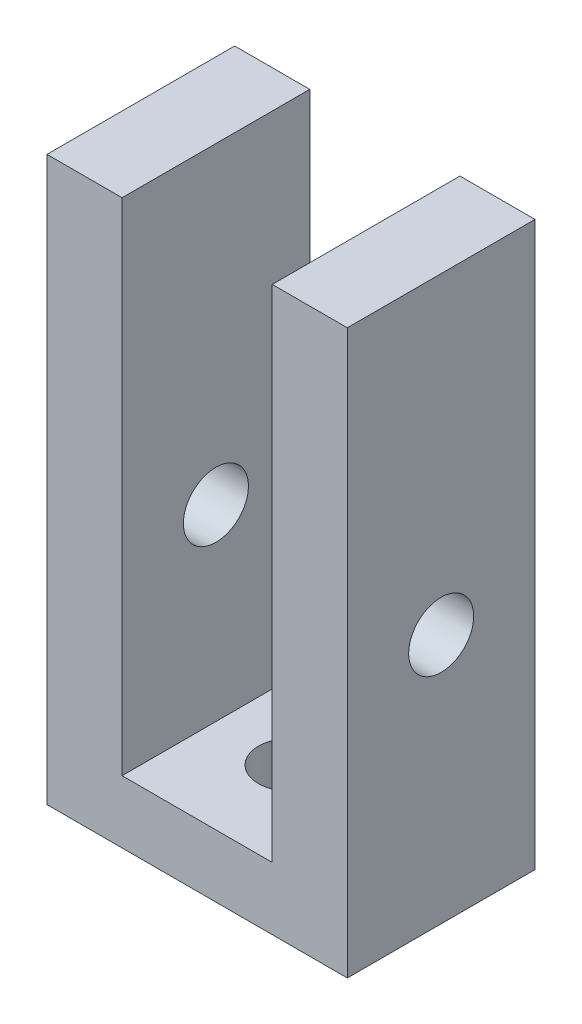
ISO-10303-21;
HEADER;
FILE_DESCRIPTION(('STEP AP214'),'2;1');
FILE_NAME('part.step','',(''),(''),'','','');
FILE_SCHEMA(('AUTOMOTIVE_DESIGN { 1 0 10303 214 1 1 1 1 }'));
ENDSEC;
DATA;
#1=APPLICATION_CONTEXT('core data for automotive mechanical design processes');
#2=APPLICATION_PROTOCOL_DEFINITION('international standard','automotive_design',2000,#1);
#3=PRODUCT_CONTEXT('',#1,'mechanical');
#4=PRODUCT('Part','Part','',(#3));
#5=PRODUCT_RELATED_PRODUCT_CATEGORY('part','',(#4));
#6=PRODUCT_DEFINITION_FORMATION('','',#4);
#7=PRODUCT_DEFINITION_CONTEXT('part definition',#1,'design');
#8=PRODUCT_DEFINITION('design','',#6,#7);
#9=PRODUCT_DEFINITION_SHAPE('','',#8);
#10=(LENGTH_UNIT() NAMED_UNIT(*) SI_UNIT(.MILLI.,.METRE.));
#11=(NAMED_UNIT(*) PLANE_ANGLE_UNIT() SI_UNIT($,.RADIAN.));
#12=(NAMED_UNIT(*) SI_UNIT($,.STERADIAN.) SOLID_ANGLE_UNIT());
#13=UNCERTAINTY_MEASURE_WITH_UNIT(LENGTH_MEASURE(1.E-05),#10,'distance_accuracy_value','');
#14=(GEOMETRIC_REPRESENTATION_CONTEXT(3) GLOBAL_UNCERTAINTY_ASSIGNED_CONTEXT((#13)) GLOBAL_UNIT_ASSIGNED_CONTEXT((#10,
#11,#12)) REPRESENTATION_CONTEXT('',''));
#15=CARTESIAN_POINT('',(0.,0.,0.));
#16=DIRECTION('',(0.,0.,1.));
#17=DIRECTION('',(1.,0.,0.));
#18=AXIS2_PLACEMENT_3D('',#15,#16,#17);
#19=CARTESIAN_POINT('',(0.,5.,-15.));
#20=DIRECTION('',(0.,-1.,0.));
#21=DIRECTION('',(0.,0.,-1.));
#22=AXIS2_PLACEMENT_3D('',#19,#20,#21);
#23=PLANE('',#22);
#24=CARTESIAN_POINT('',(12.,5.,-7.5));
#25=DIRECTION('',(0.,1.,0.));
#26=DIRECTION('',(0.,0.,1.));
#27=AXIS2_PLACEMENT_3D('',#24,#25,#26);
#28=CIRCLE('',#27,2.6);
#29=CARTESIAN_POINT('',(12.,5.,-4.9));
#30=VERTEX_POINT('',#29);
#31=EDGE_CURVE('E150',#30,#30,#28,.T.);
#32=ORIENTED_EDGE('',*,*,#31,.F.);
#33=EDGE_LOOP('',(#32));
#34=FACE_BOUND('',#33,.T.);
#35=DIRECTION('',(0.,0.,1.));
#36=VECTOR('',#35,1.);
#37=CARTESIAN_POINT('',(18.,5.,-15.));
#38=LINE('',#37,#36);
#39=CARTESIAN_POINT('',(18.,5.,-15.));
#40=VERTEX_POINT('',#39);
#41=CARTESIAN_POINT('',(18.,5.,0.));
#42=VERTEX_POINT('',#41);
#43=EDGE_CURVE('E124',#40,#42,#38,.T.);
#44=ORIENTED_EDGE('',*,*,#43,.F.);
#45=DIRECTION('',(-1.,0.,0.));
#46=VECTOR('',#45,1.);
#47=CARTESIAN_POINT('',(0.,5.,-15.));
#48=LINE('',#47,#46);
#49=CARTESIAN_POINT('',(6.,5.,-15.));
#50=VERTEX_POINT('',#49);
#51=EDGE_CURVE('E165',#40,#50,#48,.T.);
#52=ORIENTED_EDGE('',*,*,#51,.T.);
#53=DIRECTION('',(0.,0.,-1.));
#54=VECTOR('',#53,1.);
#55=CARTESIAN_POINT('',(6.,5.,-15.));
#56=LINE('',#55,#54);
#57=CARTESIAN_POINT('',(6.,5.,0.));
#58=VERTEX_POINT('',#57);
#59=EDGE_CURVE('E55',#58,#50,#56,.T.);
#60=ORIENTED_EDGE('',*,*,#59,.F.);
#61=DIRECTION('',(1.,0.,0.));
#62=VECTOR('',#61,1.);
#63=CARTESIAN_POINT('',(0.,5.,0.));
#64=LINE('',#63,#62);
#65=EDGE_CURVE('E50',#58,#42,#64,.T.);
#66=ORIENTED_EDGE('',*,*,#65,.T.);
#67=EDGE_LOOP('',(#44,#52,#60,#66));
#68=FACE_BOUND('',#67,.T.);
#69=ADVANCED_FACE('F33',(#34,#68),#23,.F.);
#70=CARTESIAN_POINT('',(0.,5.,0.));
#71=DIRECTION('',(1.,0.,0.));
#72=DIRECTION('',(0.,0.,-1.));
#73=AXIS2_PLACEMENT_3D('',#70,#71,#72);
#74=PLANE('',#73);
#75=CARTESIAN_POINT('',(0.,20.,-7.5));
#76=DIRECTION('',(-1.,0.,0.));
#77=DIRECTION('',(0.,0.,1.));
#78=AXIS2_PLACEMENT_3D('',#75,#76,#77);
#79=CIRCLE('',#78,2.6);
#80=CARTESIAN_POINT('',(0.,20.,-4.9));
#81=VERTEX_POINT('',#80);
#82=EDGE_CURVE('E334',#81,#81,#79,.T.);
#83=ORIENTED_EDGE('',*,*,#82,.F.);
#84=EDGE_LOOP('',(#83));
#85=FACE_BOUND('',#84,.T.);
#86=DIRECTION('',(0.,0.,1.));
#87=VECTOR('',#86,1.);
#88=CARTESIAN_POINT('',(0.,0.,0.));
#89=LINE('',#88,#87);
#90=CARTESIAN_POINT('',(0.,0.,-15.));
#91=VERTEX_POINT('',#90);
#92=CARTESIAN_POINT('',(0.,0.,0.));
#93=VERTEX_POINT('',#92);
#94=EDGE_CURVE('E170',#91,#93,#89,.T.);
#95=ORIENTED_EDGE('',*,*,#94,.T.);
#96=DIRECTION('',(0.,-1.,0.));
#97=VECTOR('',#96,1.);
#98=CARTESIAN_POINT('',(0.,5.,0.));
#99=LINE('',#98,#97);
#100=CARTESIAN_POINT('',(0.,45.,0.));
#101=VERTEX_POINT('',#100);
#102=EDGE_CURVE('E11',#101,#93,#99,.T.);
#103=ORIENTED_EDGE('',*,*,#102,.F.);
#104=DIRECTION('',(0.,0.,1.));
#105=VECTOR('',#104,1.);
#106=CARTESIAN_POINT('',(0.,45.,-15.));
#107=LINE('',#106,#105);
#108=CARTESIAN_POINT('',(0.,45.,-15.));
#109=VERTEX_POINT('',#108);
#110=EDGE_CURVE('E137',#109,#101,#107,.T.);
#111=ORIENTED_EDGE('',*,*,#110,.F.);
#112=DIRECTION('',(0.,-1.,0.));
#113=VECTOR('',#112,1.);
#114=CARTESIAN_POINT('',(0.,5.,-15.));
#115=LINE('',#114,#113);
#116=EDGE_CURVE('E109',#109,#91,#115,.T.);
#117=ORIENTED_EDGE('',*,*,#116,.T.);
#118=EDGE_LOOP('',(#95,#103,#111,#117));
#119=FACE_BOUND('',#118,.T.);
#120=ADVANCED_FACE('F35',(#85,#119),#74,.F.);
#121=CARTESIAN_POINT('',(0.,5.,0.));
#122=DIRECTION('',(0.,0.,-1.));
#123=DIRECTION('',(-1.,0.,0.));
#124=AXIS2_PLACEMENT_3D('',#121,#122,#123);
#125=PLANE('',#124);
#126=DIRECTION('',(1.,0.,0.));
#127=VECTOR('',#126,1.);
#128=CARTESIAN_POINT('',(0.,0.,0.));
#129=LINE('',#128,#127);
#130=CARTESIAN_POINT('',(24.,0.,0.));
#131=VERTEX_POINT('',#130);
#132=EDGE_CURVE('E173',#93,#131,#129,.T.);
#133=ORIENTED_EDGE('',*,*,#132,.T.);
#134=DIRECTION('',(0.,-1.,0.));
#135=VECTOR('',#134,1.);
#136=CARTESIAN_POINT('',(24.,5.,0.));
#137=LINE('',#136,#135);
#138=CARTESIAN_POINT('',(24.,45.,0.));
#139=VERTEX_POINT('',#138);
#140=EDGE_CURVE('E42',#139,#131,#137,.T.);
#141=ORIENTED_EDGE('',*,*,#140,.F.);
#142=DIRECTION('',(1.,0.,0.));
#143=VECTOR('',#142,1.);
#144=CARTESIAN_POINT('',(24.,45.,0.));
#145=LINE('',#144,#143);
#146=CARTESIAN_POINT('',(18.,45.,0.));
#147=VERTEX_POINT('',#146);
#148=EDGE_CURVE('E123',#147,#139,#145,.T.);
#149=ORIENTED_EDGE('',*,*,#148,.F.);
#150=DIRECTION('',(0.,-1.,0.));
#151=VECTOR('',#150,1.);
#152=CARTESIAN_POINT('',(18.,45.,0.));
#153=LINE('',#152,#151);
#154=EDGE_CURVE('E132',#147,#42,#153,.T.);
#155=ORIENTED_EDGE('',*,*,#154,.T.);
#156=ORIENTED_EDGE('',*,*,#65,.F.);
#157=DIRECTION('',(0.,-1.,0.));
#158=VECTOR('',#157,1.);
#159=CARTESIAN_POINT('',(6.,45.,0.));
#160=LINE('',#159,#158);
#161=CARTESIAN_POINT('',(6.,45.,0.));
#162=VERTEX_POINT('',#161);
#163=EDGE_CURVE('E158',#162,#58,#160,.T.);
#164=ORIENTED_EDGE('',*,*,#163,.F.);
#165=DIRECTION('',(1.,0.,0.));
#166=VECTOR('',#165,1.);
#167=CARTESIAN_POINT('',(0.,45.,0.));
#168=LINE('',#167,#166);
#169=EDGE_CURVE('E140',#101,#162,#168,.T.);
#170=ORIENTED_EDGE('',*,*,#169,.F.);
#171=ORIENTED_EDGE('',*,*,#102,.T.);
#172=EDGE_LOOP('',(#133,#141,#149,#155,#156,#164,#170,#171));
#173=FACE_BOUND('',#172,.T.);
#174=ADVANCED_FACE('F195',(#173),#125,.F.);
#175=CARTESIAN_POINT('',(24.,5.,0.));
#176=DIRECTION('',(-1.,0.,0.));
#177=DIRECTION('',(0.,0.,1.));
#178=AXIS2_PLACEMENT_3D('',#175,#176,#177);
#179=PLANE('',#178);
#180=CARTESIAN_POINT('',(24.,20.,-7.5));
#181=DIRECTION('',(-1.,0.,0.));
#182=DIRECTION('',(0.,0.,1.));
#183=AXIS2_PLACEMENT_3D('',#180,#181,#182);
#184=CIRCLE('',#183,2.6);
#185=CARTESIAN_POINT('',(24.,20.,-4.9));
#186=VERTEX_POINT('',#185);
#187=EDGE_CURVE('E338',#186,#186,#184,.T.);
#188=ORIENTED_EDGE('',*,*,#187,.T.);
#189=EDGE_LOOP('',(#188));
#190=FACE_BOUND('',#189,.T.);
#191=DIRECTION('',(0.,0.,-1.));
#192=VECTOR('',#191,1.);
#193=CARTESIAN_POINT('',(24.,0.,0.));
#194=LINE('',#193,#192);
#195=CARTESIAN_POINT('',(24.,0.,-15.));
#196=VERTEX_POINT('',#195);
#197=EDGE_CURVE('E106',#131,#196,#194,.T.);
#198=ORIENTED_EDGE('',*,*,#197,.T.);
#199=DIRECTION('',(0.,-1.,0.));
#200=VECTOR('',#199,1.);
#201=CARTESIAN_POINT('',(24.,5.,-15.));
#202=LINE('',#201,#200);
#203=CARTESIAN_POINT('',(24.,45.,-15.));
#204=VERTEX_POINT('',#203);
#205=EDGE_CURVE('E99',#204,#196,#202,.T.);
#206=ORIENTED_EDGE('',*,*,#205,.F.);
#207=DIRECTION('',(0.,0.,-1.));
#208=VECTOR('',#207,1.);
#209=CARTESIAN_POINT('',(24.,45.,-15.));
#210=LINE('',#209,#208);
#211=EDGE_CURVE('E104',#139,#204,#210,.T.);
#212=ORIENTED_EDGE('',*,*,#211,.F.);
#213=ORIENTED_EDGE('',*,*,#140,.T.);
#214=EDGE_LOOP('',(#198,#206,#212,#213));
#215=FACE_BOUND('',#214,.T.);
#216=ADVANCED_FACE('F101',(#190,#215),#179,.F.);
#217=CARTESIAN_POINT('',(0.,5.,-15.));
#218=DIRECTION('',(0.,0.,1.));
#219=DIRECTION('',(1.,0.,0.));
#220=AXIS2_PLACEMENT_3D('',#217,#218,#219);
#221=PLANE('',#220);
#222=DIRECTION('',(-1.,0.,0.));
#223=VECTOR('',#222,1.);
#224=CARTESIAN_POINT('',(0.,0.,-15.));
#225=LINE('',#224,#223);
#226=EDGE_CURVE('E176',#196,#91,#225,.T.);
#227=ORIENTED_EDGE('',*,*,#226,.T.);
#228=ORIENTED_EDGE('',*,*,#116,.F.);
#229=DIRECTION('',(-1.,0.,0.));
#230=VECTOR('',#229,1.);
#231=CARTESIAN_POINT('',(0.,45.,-15.));
#232=LINE('',#231,#230);
#233=CARTESIAN_POINT('',(6.,45.,-15.));
#234=VERTEX_POINT('',#233);
#235=EDGE_CURVE('E144',#234,#109,#232,.T.);
#236=ORIENTED_EDGE('',*,*,#235,.F.);
#237=DIRECTION('',(0.,-1.,0.));
#238=VECTOR('',#237,1.);
#239=CARTESIAN_POINT('',(6.,45.,-15.));
#240=LINE('',#239,#238);
#241=EDGE_CURVE('E147',#234,#50,#240,.T.);
#242=ORIENTED_EDGE('',*,*,#241,.T.);
#243=ORIENTED_EDGE('',*,*,#51,.F.);
#244=DIRECTION('',(0.,-1.,0.));
#245=VECTOR('',#244,1.);
#246=CARTESIAN_POINT('',(18.,45.,-15.));
#247=LINE('',#246,#245);
#248=CARTESIAN_POINT('',(18.,45.,-15.));
#249=VERTEX_POINT('',#248);
#250=EDGE_CURVE('E115',#249,#40,#247,.T.);
#251=ORIENTED_EDGE('',*,*,#250,.F.);
#252=DIRECTION('',(-1.,0.,0.));
#253=VECTOR('',#252,1.);
#254=CARTESIAN_POINT('',(24.,45.,-15.));
#255=LINE('',#254,#253);
#256=EDGE_CURVE('E112',#204,#249,#255,.T.);
#257=ORIENTED_EDGE('',*,*,#256,.F.);
#258=ORIENTED_EDGE('',*,*,#205,.T.);
#259=EDGE_LOOP('',(#227,#228,#236,#242,#243,#251,#257,#258));
#260=FACE_BOUND('',#259,.T.);
#261=ADVANCED_FACE('F113',(#260),#221,.F.);
#262=CARTESIAN_POINT('',(0.,0.,-15.));
#263=DIRECTION('',(0.,-1.,0.));
#264=DIRECTION('',(0.,0.,-1.));
#265=AXIS2_PLACEMENT_3D('',#262,#263,#264);
#266=PLANE('',#265);
#267=CARTESIAN_POINT('',(12.,0.,-7.5));
#268=DIRECTION('',(0.,-1.,0.));
#269=DIRECTION('',(0.,0.,-1.));
#270=AXIS2_PLACEMENT_3D('',#267,#268,#269);
#271=CIRCLE('',#270,2.6);
#272=CARTESIAN_POINT('',(12.,0.,-10.1));
#273=VERTEX_POINT('',#272);
#274=EDGE_CURVE('E163',#273,#273,#271,.F.);
#275=ORIENTED_EDGE('',*,*,#274,.T.);
#276=EDGE_LOOP('',(#275));
#277=FACE_BOUND('',#276,.T.);
#278=ORIENTED_EDGE('',*,*,#94,.F.);
#279=ORIENTED_EDGE('',*,*,#226,.F.);
#280=ORIENTED_EDGE('',*,*,#197,.F.);
#281=ORIENTED_EDGE('',*,*,#132,.F.);
#282=EDGE_LOOP('',(#278,#279,#280,#281));
#283=FACE_BOUND('',#282,.T.);
#284=ADVANCED_FACE('F183',(#277,#283),#266,.T.);
#285=CARTESIAN_POINT('',(12.,-0.00100000000000013,-7.5));
#286=DIRECTION('',(0.,1.,0.));
#287=DIRECTION('',(0.,0.,1.));
#288=AXIS2_PLACEMENT_3D('',#285,#286,#287);
#289=CYLINDRICAL_SURFACE('',#288,2.6);
#290=ORIENTED_EDGE('',*,*,#274,.F.);
#291=EDGE_LOOP('',(#290));
#292=FACE_BOUND('',#291,.T.);
#293=ORIENTED_EDGE('',*,*,#31,.T.);
#294=EDGE_LOOP('',(#293));
#295=FACE_BOUND('',#294,.T.);
#296=ADVANCED_FACE('F209',(#292,#295),#289,.F.);
#297=CARTESIAN_POINT('',(6.,45.,-15.));
#298=DIRECTION('',(-1.,0.,0.));
#299=DIRECTION('',(0.,0.,1.));
#300=AXIS2_PLACEMENT_3D('',#297,#298,#299);
#301=PLANE('',#300);
#302=CARTESIAN_POINT('',(6.,20.,-7.5));
#303=DIRECTION('',(-1.,0.,0.));
#304=DIRECTION('',(0.,0.,1.));
#305=AXIS2_PLACEMENT_3D('',#302,#303,#304);
#306=CIRCLE('',#305,2.6);
#307=CARTESIAN_POINT('',(6.,20.,-4.9));
#308=VERTEX_POINT('',#307);
#309=EDGE_CURVE('E126',#308,#308,#306,.T.);
#310=ORIENTED_EDGE('',*,*,#309,.T.);
#311=EDGE_LOOP('',(#310));
#312=FACE_BOUND('',#311,.T.);
#313=ORIENTED_EDGE('',*,*,#59,.T.);
#314=ORIENTED_EDGE('',*,*,#241,.F.);
#315=DIRECTION('',(0.,0.,-1.));
#316=VECTOR('',#315,1.);
#317=CARTESIAN_POINT('',(6.,45.,-15.));
#318=LINE('',#317,#316);
#319=EDGE_CURVE('E142',#162,#234,#318,.T.);
#320=ORIENTED_EDGE('',*,*,#319,.F.);
#321=ORIENTED_EDGE('',*,*,#163,.T.);
#322=EDGE_LOOP('',(#313,#314,#320,#321));
#323=FACE_BOUND('',#322,.T.);
#324=ADVANCED_FACE('F194',(#312,#323),#301,.F.);
#325=CARTESIAN_POINT('',(0.,45.,0.));
#326=DIRECTION('',(0.,1.,0.));
#327=DIRECTION('',(0.,0.,1.));
#328=AXIS2_PLACEMENT_3D('',#325,#326,#327);
#329=PLANE('',#328);
#330=ORIENTED_EDGE('',*,*,#110,.T.);
#331=ORIENTED_EDGE('',*,*,#169,.T.);
#332=ORIENTED_EDGE('',*,*,#319,.T.);
#333=ORIENTED_EDGE('',*,*,#235,.T.);
#334=EDGE_LOOP('',(#330,#331,#332,#333));
#335=FACE_BOUND('',#334,.T.);
#336=ADVANCED_FACE('F189',(#335),#329,.T.);
#337=CARTESIAN_POINT('',(18.,45.,-15.));
#338=DIRECTION('',(1.,0.,0.));
#339=DIRECTION('',(0.,0.,-1.));
#340=AXIS2_PLACEMENT_3D('',#337,#338,#339);
#341=PLANE('',#340);
#342=CARTESIAN_POINT('',(18.,20.,-7.5));
#343=DIRECTION('',(1.,0.,0.));
#344=DIRECTION('',(0.,0.,-1.));
#345=AXIS2_PLACEMENT_3D('',#342,#343,#344);
#346=CIRCLE('',#345,2.6);
#347=CARTESIAN_POINT('',(18.,20.,-10.1));
#348=VERTEX_POINT('',#347);
#349=EDGE_CURVE('E37',#348,#348,#346,.T.);
#350=ORIENTED_EDGE('',*,*,#349,.T.);
#351=EDGE_LOOP('',(#350));
#352=FACE_BOUND('',#351,.T.);
#353=ORIENTED_EDGE('',*,*,#43,.T.);
#354=ORIENTED_EDGE('',*,*,#154,.F.);
#355=DIRECTION('',(0.,0.,1.));
#356=VECTOR('',#355,1.);
#357=CARTESIAN_POINT('',(18.,45.,-15.));
#358=LINE('',#357,#356);
#359=EDGE_CURVE('E118',#249,#147,#358,.T.);
#360=ORIENTED_EDGE('',*,*,#359,.F.);
#361=ORIENTED_EDGE('',*,*,#250,.T.);
#362=EDGE_LOOP('',(#353,#354,#360,#361));
#363=FACE_BOUND('',#362,.T.);
#364=ADVANCED_FACE('F198',(#352,#363),#341,.F.);
#365=CARTESIAN_POINT('',(24.,45.,0.));
#366=DIRECTION('',(0.,-1.,0.));
#367=DIRECTION('',(0.,0.,-1.));
#368=AXIS2_PLACEMENT_3D('',#365,#366,#367);
#369=PLANE('',#368);
#370=ORIENTED_EDGE('',*,*,#211,.T.);
#371=ORIENTED_EDGE('',*,*,#256,.T.);
#372=ORIENTED_EDGE('',*,*,#359,.T.);
#373=ORIENTED_EDGE('',*,*,#148,.T.);
#374=EDGE_LOOP('',(#370,#371,#372,#373));
#375=FACE_BOUND('',#374,.T.);
#376=ADVANCED_FACE('F121',(#375),#369,.F.);
#377=CARTESIAN_POINT('',(24.,20.,-7.5));
#378=DIRECTION('',(-1.,0.,0.));
#379=DIRECTION('',(0.,0.,1.));
#380=AXIS2_PLACEMENT_3D('',#377,#378,#379);
#381=CYLINDRICAL_SURFACE('',#380,2.6);
#382=ORIENTED_EDGE('',*,*,#187,.F.);
#383=EDGE_LOOP('',(#382));
#384=FACE_BOUND('',#383,.T.);
#385=ORIENTED_EDGE('',*,*,#349,.F.);
#386=EDGE_LOOP('',(#385));
#387=FACE_BOUND('',#386,.T.);
#388=ADVANCED_FACE('F267',(#384,#387),#381,.F.);
#389=ORIENTED_EDGE('',*,*,#82,.T.);
#390=EDGE_LOOP('',(#389));
#391=FACE_BOUND('',#390,.T.);
#392=ORIENTED_EDGE('',*,*,#309,.F.);
#393=EDGE_LOOP('',(#392));
#394=FACE_BOUND('',#393,.T.);
#395=ADVANCED_FACE('F273',(#391,#394),#381,.F.);
#396=CLOSED_SHELL('',(#69,#120,#174,#216,#261,#284,#296,#324,#336,#364,#376,#388,#395));
#397=MANIFOLD_SOLID_BREP('B2',#396);
#398=ADVANCED_BREP_SHAPE_REPRESENTATION('',(#18,#397),#14);
#399=SHAPE_DEFINITION_REPRESENTATION(#9,#398);
ENDSEC;
END-ISO-10303-21;
